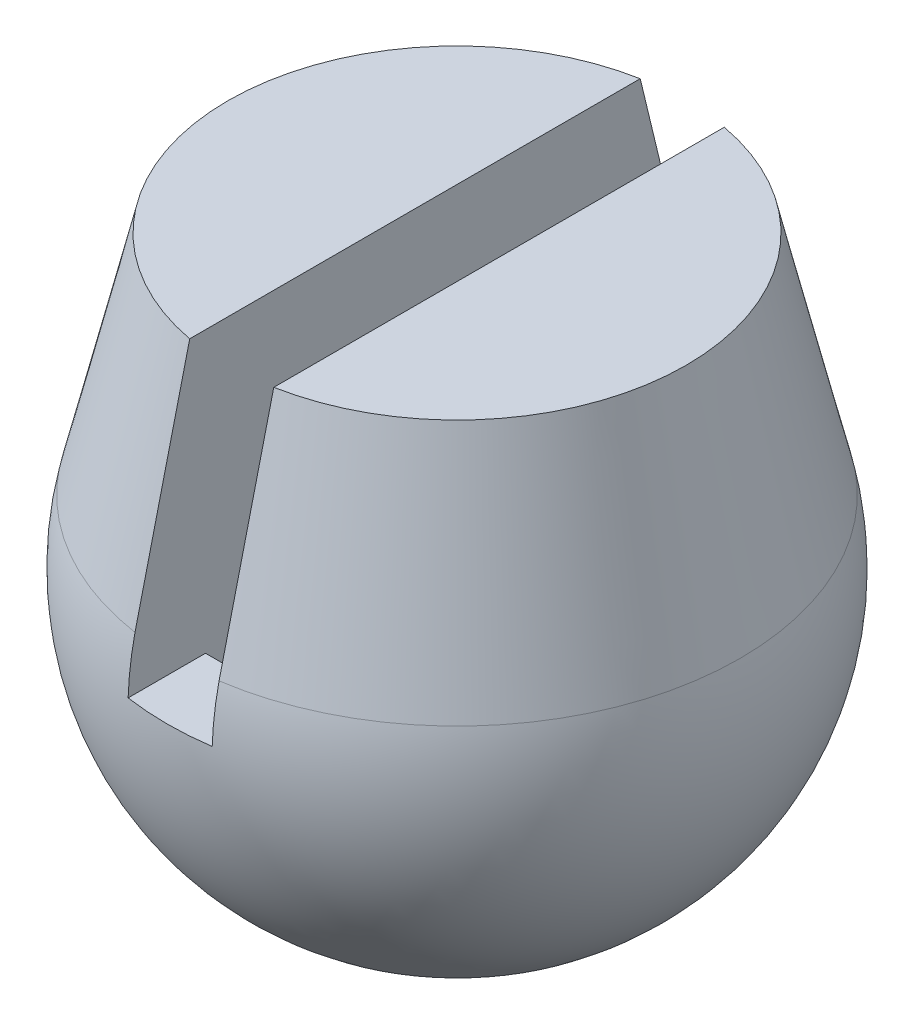
ISO-10303-21;
HEADER;
FILE_DESCRIPTION(('STEP AP214'),'2;1');
FILE_NAME('part.step','',(''),(''),'','','');
FILE_SCHEMA(('AUTOMOTIVE_DESIGN { 1 0 10303 214 1 1 1 1 }'));
ENDSEC;
DATA;
#1=APPLICATION_CONTEXT('core data for automotive mechanical design processes');
#2=APPLICATION_PROTOCOL_DEFINITION('international standard','automotive_design',2000,#1);
#3=PRODUCT_CONTEXT('',#1,'mechanical');
#4=PRODUCT('Part','Part','',(#3));
#5=PRODUCT_RELATED_PRODUCT_CATEGORY('part','',(#4));
#6=PRODUCT_DEFINITION_FORMATION('','',#4);
#7=PRODUCT_DEFINITION_CONTEXT('part definition',#1,'design');
#8=PRODUCT_DEFINITION('design','',#6,#7);
#9=PRODUCT_DEFINITION_SHAPE('','',#8);
#10=(LENGTH_UNIT() NAMED_UNIT(*) SI_UNIT(.MILLI.,.METRE.));
#11=(NAMED_UNIT(*) PLANE_ANGLE_UNIT() SI_UNIT($,.RADIAN.));
#12=(NAMED_UNIT(*) SI_UNIT($,.STERADIAN.) SOLID_ANGLE_UNIT());
#13=UNCERTAINTY_MEASURE_WITH_UNIT(LENGTH_MEASURE(1.E-05),#10,'distance_accuracy_value','');
#14=(GEOMETRIC_REPRESENTATION_CONTEXT(3) GLOBAL_UNCERTAINTY_ASSIGNED_CONTEXT((#13)) GLOBAL_UNIT_ASSIGNED_CONTEXT((#10,
#11,#12)) REPRESENTATION_CONTEXT('',''));
#15=CARTESIAN_POINT('',(0.,0.,0.));
#16=DIRECTION('',(0.,0.,1.));
#17=DIRECTION('',(1.,0.,0.));
#18=AXIS2_PLACEMENT_3D('',#15,#16,#17);
#19=CARTESIAN_POINT('',(3.,-214.296381354827,0.));
#20=DIRECTION('',(0.,-1.,0.));
#21=DIRECTION('',(0.,0.,-1.));
#22=AXIS2_PLACEMENT_3D('',#19,#20,#21);
#23=CONICAL_SURFACE('',#22,16.3539586278478,0.233560326488477);
#24=CARTESIAN_POINT('',(6.,-170.760987781292,-5.19245738028101));
#25=CARTESIAN_POINT('',(6.,-171.152339556578,-5.29997422498127));
#26=CARTESIAN_POINT('',(6.,-171.543899177338,-5.40673094624718));
#27=CARTESIAN_POINT('',(6.,-172.327371655177,-5.61893562567191));
#28=CARTESIAN_POINT('',(6.,-172.7192845111,-5.72438358809773));
#29=CARTESIAN_POINT('',(6.,-173.895452516834,-6.03907977744265));
#30=CARTESIAN_POINT('',(6.,-174.680147653396,-6.24668319219597));
#31=CARTESIAN_POINT('',(6.,-176.25036104458,-6.65863558368012));
#32=CARTESIAN_POINT('',(6.,-177.035879270145,-6.86298467142659));
#33=CARTESIAN_POINT('',(6.,-178.607561825459,-7.26919395756321));
#34=CARTESIAN_POINT('',(6.,-179.393726157788,-7.47105414595941));
#35=CARTESIAN_POINT('',(6.,-180.966514468548,-7.87281296373439));
#36=CARTESIAN_POINT('',(6.,-181.753138422609,-8.07271168859392));
#37=CARTESIAN_POINT('',(6.,-183.326782555779,-8.47094399700544));
#38=CARTESIAN_POINT('',(6.,-184.113802735074,-8.66927757981822));
#39=CARTESIAN_POINT('',(6.,-186.475342069608,-9.26238496605862));
#40=CARTESIAN_POINT('',(6.,-188.050336870837,-9.65526460523662));
#41=CARTESIAN_POINT('',(6.,-191.201194203563,-10.4375583766507));
#42=CARTESIAN_POINT('',(6.,-192.777056739577,-10.8269724906596));
#43=CARTESIAN_POINT('',(6.,-195.929400919066,-11.6032882258658));
#44=CARTESIAN_POINT('',(6.,-197.505882562779,-11.9901898460963));
#45=CARTESIAN_POINT('',(6.,-200.659422500995,-12.7621491495812));
#46=CARTESIAN_POINT('',(6.,-202.236480829917,-13.1472066921519));
#47=CARTESIAN_POINT('',(6.,-205.390948917384,-13.9158809225771));
#48=CARTESIAN_POINT('',(6.,-206.968358676022,-14.2994976100501));
#49=CARTESIAN_POINT('',(6.,-211.700980625389,-15.4486694046429));
#50=CARTESIAN_POINT('',(6.,-214.856599454792,-16.2125496559024));
#51=CARTESIAN_POINT('',(6.,-220.345678360972,-17.5386375159856));
#52=CARTESIAN_POINT('',(6.,-222.678980722647,-18.1014986045923));
#53=CARTESIAN_POINT('',(6.,-227.345876258061,-19.2260144525533));
#54=CARTESIAN_POINT('',(6.,-229.679469431814,-19.7876692118447));
#55=CARTESIAN_POINT('',(6.,-236.680587596679,-21.4712597645256));
#56=CARTESIAN_POINT('',(6.,-241.348443338517,-22.5918199281226));
#57=CARTESIAN_POINT('',(6.,-250.683987051346,-24.8304613976882));
#58=CARTESIAN_POINT('',(6.,-255.35167493703,-25.9485430595647));
#59=CARTESIAN_POINT('',(6.,-262.353483594681,-27.6244866289855));
#60=CARTESIAN_POINT('',(6.,-264.687463440813,-28.1829373980252));
#61=CARTESIAN_POINT('',(6.,-269.355502685283,-29.2995061349429));
#62=CARTESIAN_POINT('',(6.,-271.689562083618,-29.8576241028282));
#63=CARTESIAN_POINT('',(6.,-274.023654109719,-30.415605567692));
#64=B_SPLINE_CURVE_WITH_KNOTS('',3,(#24,#25,#26,#27,#28,#29,#30,#31,#32,#33,#34,#35,#36,#37,#38,
#39,#40,#41,#42,#43,#44,#45,#46,#47,#48,#49,#50,#51,#52,#53,#54,#55,#56,#57,#58,#59,#60,#61,#62,
#63),.UNSPECIFIED.,.F.,.F.,(4,2,2,2,2,2,2,2,2,2,2,2,2,2,2,2,2,2,2,4),(0.,1.21755467999411,
2.43510538930607,4.87017399931247,7.3051593625382,9.74015450005243,12.1750305121332,
14.609907674147,19.479671751555,24.3494614266647,29.2192529752596,34.0894103010007,
38.9595689160091,48.6998430181234,55.900538064785,63.1012334879054,77.5026486924067,
91.9018410898275,99.1014217965334,106.301002347248),.UNSPECIFIED.);
#65=CARTESIAN_POINT('',(6.,-214.296381354827,-16.0764412355894));
#66=VERTEX_POINT('',#65);
#67=CARTESIAN_POINT('',(6.,-230.488260536183,-19.9820927836749));
#68=VERTEX_POINT('',#67);
#69=EDGE_CURVE('E139',#66,#68,#64,.T.);
#70=ORIENTED_EDGE('',*,*,#69,.F.);
#71=CARTESIAN_POINT('',(3.,-214.296381354827,0.));
#72=DIRECTION('',(0.,1.,0.));
#73=DIRECTION('',(0.,0.,1.));
#74=AXIS2_PLACEMENT_3D('',#71,#72,#73);
#75=CIRCLE('',#74,16.3539586278478);
#76=CARTESIAN_POINT('',(6.,-214.296381354827,16.0764412355894));
#77=VERTEX_POINT('',#76);
#78=EDGE_CURVE('E123',#77,#66,#75,.T.);
#79=ORIENTED_EDGE('',*,*,#78,.F.);
#80=CARTESIAN_POINT('',(6.,-274.023654109719,30.415605567692));
#81=CARTESIAN_POINT('',(6.,-270.000477348666,29.4538125229353));
#82=CARTESIAN_POINT('',(6.,-265.977388390198,28.491651795725));
#83=CARTESIAN_POINT('',(6.,-257.931498134603,26.5662005217427));
#84=CARTESIAN_POINT('',(6.,-253.908696836375,25.6029099795729));
#85=CARTESIAN_POINT('',(6.,-245.863521936446,23.6748113527444));
#86=CARTESIAN_POINT('',(6.,-241.841148329211,22.7100032911827));
#87=CARTESIAN_POINT('',(6.,-235.807985311275,21.2611023165772));
#88=CARTESIAN_POINT('',(6.,-233.79699333259,20.7778529126038));
#89=CARTESIAN_POINT('',(6.,-229.775176294388,19.8106574887187));
#90=CARTESIAN_POINT('',(6.,-227.764351234918,19.3267114686137));
#91=CARTESIAN_POINT('',(6.,-223.458394072702,18.2894134031004));
#92=CARTESIAN_POINT('',(6.,-221.163293595189,17.7359300529398));
#93=CARTESIAN_POINT('',(6.,-216.573453368332,16.6274792065746));
#94=CARTESIAN_POINT('',(6.,-214.27871361863,16.0725117118498));
#95=CARTESIAN_POINT('',(6.,-209.689747268341,14.9605700929428));
#96=CARTESIAN_POINT('',(6.,-207.395520662324,14.4035959911745));
#97=CARTESIAN_POINT('',(6.,-202.807742764263,13.2868340441725));
#98=CARTESIAN_POINT('',(6.,-200.514191474728,12.727046188622));
#99=CARTESIAN_POINT('',(6.,-197.074583786526,11.8842349196711));
#100=CARTESIAN_POINT('',(6.,-195.928145373782,11.6027707195232));
#101=CARTESIAN_POINT('',(6.,-193.635588961686,11.0385427155266));
#102=CARTESIAN_POINT('',(6.,-192.489470962151,10.7557789124224));
#103=CARTESIAN_POINT('',(6.,-190.197651752511,10.1886192097413));
#104=CARTESIAN_POINT('',(6.,-189.051950538059,9.90422332773676));
#105=CARTESIAN_POINT('',(6.,-186.761069556327,9.33332685126513));
#106=CARTESIAN_POINT('',(6.,-185.615889790181,9.0468262522429));
#107=CARTESIAN_POINT('',(6.,-183.326175705723,8.47103377095674));
#108=CARTESIAN_POINT('',(6.,-182.181641419537,8.18174176085494));
#109=CARTESIAN_POINT('',(6.,-179.893536957816,7.59938945028861));
#110=CARTESIAN_POINT('',(6.,-178.749966776562,7.30632917234705));
#111=CARTESIAN_POINT('',(6.,-177.03563136397,6.8627051903555));
#112=CARTESIAN_POINT('',(6.,-176.464345110815,6.7141553428079));
#113=CARTESIAN_POINT('',(6.,-175.32220397032,6.41541018173933));
#114=CARTESIAN_POINT('',(6.,-174.751349082108,6.26521487155134));
#115=CARTESIAN_POINT('',(6.,-173.610160366917,5.96280809065522));
#116=CARTESIAN_POINT('',(6.,-173.039826550615,5.81059657958148));
#117=CARTESIAN_POINT('',(6.,-171.899848608291,5.50359836447139));
#118=CARTESIAN_POINT('',(6.,-171.330204487113,5.34881164245966));
#119=CARTESIAN_POINT('',(6.,-170.760987781292,5.192457380281));
#120=B_SPLINE_CURVE_WITH_KNOTS('',3,(#80,#81,#82,#83,#84,#85,#86,#87,#88,#89,#90,#91,#92,#93,
#94,#95,#96,#97,#98,#99,#100,#101,#102,#103,#104,#105,#106,#107,#108,#109,#110,#111,#112,#113,
#114,#115,#116,#117,#118,#119),.UNSPECIFIED.,.F.,.F.,(4,2,2,2,2,2,2,2,2,2,2,2,2,2,2,2,2,2,2,4),
(0.,12.4096324227305,24.8192144700223,37.2286094341486,43.433330809057,49.6380539055051,
56.7207416117209,63.80342225863,70.8860240361715,77.9686518016878,81.5101040663875,
85.05155430239,88.5929664791209,92.1343863226141,95.6759691291514,99.2175307774447,
100.988380430485,102.759226497227,104.530108071163,106.301002011313),.UNSPECIFIED.);
#121=CARTESIAN_POINT('',(6.,-230.488260536183,19.9820927836749));
#122=VERTEX_POINT('',#121);
#123=EDGE_CURVE('E130',#122,#77,#120,.T.);
#124=ORIENTED_EDGE('',*,*,#123,.F.);
#125=CARTESIAN_POINT('',(3.,-230.488260536183,0.));
#126=DIRECTION('',(0.,1.,0.));
#127=DIRECTION('',(0.,0.,1.));
#128=AXIS2_PLACEMENT_3D('',#125,#126,#127);
#129=CIRCLE('',#128,20.2060394935621);
#130=EDGE_CURVE('E11',#122,#68,#129,.T.);
#131=ORIENTED_EDGE('',*,*,#130,.T.);
#132=EDGE_LOOP('',(#70,#79,#124,#131));
#133=FACE_BOUND('',#132,.T.);
#134=ADVANCED_FACE('F43',(#133),#23,.T.);
#135=CARTESIAN_POINT('',(3.,-214.296381354827,0.));
#136=DIRECTION('',(0.,1.,0.));
#137=DIRECTION('',(0.,0.,1.));
#138=AXIS2_PLACEMENT_3D('',#135,#136,#137);
#139=PLANE('',#138);
#140=DIRECTION('',(0.,0.,1.));
#141=VECTOR('',#140,1.);
#142=CARTESIAN_POINT('',(6.,-214.296381354827,0.));
#143=LINE('',#142,#141);
#144=EDGE_CURVE('E119',#66,#77,#143,.T.);
#145=ORIENTED_EDGE('',*,*,#144,.T.);
#146=ORIENTED_EDGE('',*,*,#78,.T.);
#147=EDGE_LOOP('',(#145,#146));
#148=FACE_BOUND('',#147,.T.);
#149=ADVANCED_FACE('F121',(#148),#139,.T.);
#150=CARTESIAN_POINT('',(3.,-235.,0.));
#151=DIRECTION('',(0.,1.,0.));
#152=DIRECTION('',(0.,0.,-1.));
#153=AXIS2_PLACEMENT_3D('',#150,#151,#152);
#154=SPHERICAL_SURFACE('',#153,20.703618645173);
#155=ORIENTED_EDGE('',*,*,#130,.F.);
#156=CARTESIAN_POINT('',(6.,-235.,0.));
#157=DIRECTION('',(1.,0.,0.));
#158=DIRECTION('',(0.,0.,-1.));
#159=AXIS2_PLACEMENT_3D('',#156,#157,#158);
#160=CIRCLE('',#159,20.4851122770844);
#161=CARTESIAN_POINT('',(6.,-234.296381354827,20.4730248328604));
#162=VERTEX_POINT('',#161);
#163=EDGE_CURVE('E134',#122,#162,#160,.T.);
#164=ORIENTED_EDGE('',*,*,#163,.T.);
#165=CARTESIAN_POINT('',(3.,-234.296381354827,0.));
#166=DIRECTION('',(0.,-1.,0.));
#167=DIRECTION('',(0.,0.,-1.));
#168=AXIS2_PLACEMENT_3D('',#165,#166,#167);
#169=CIRCLE('',#168,20.6916588461853);
#170=CARTESIAN_POINT('',(0.,-234.296381354827,20.4730248328604));
#171=VERTEX_POINT('',#170);
#172=EDGE_CURVE('E203',#162,#171,#169,.T.);
#173=ORIENTED_EDGE('',*,*,#172,.T.);
#174=CARTESIAN_POINT('',(0.,-235.,0.));
#175=DIRECTION('',(-1.,0.,0.));
#176=DIRECTION('',(0.,0.,1.));
#177=AXIS2_PLACEMENT_3D('',#174,#175,#176);
#178=CIRCLE('',#177,20.4851122770844);
#179=CARTESIAN_POINT('',(0.,-230.488260536183,19.9820927836749));
#180=VERTEX_POINT('',#179);
#181=EDGE_CURVE('E137',#171,#180,#178,.T.);
#182=ORIENTED_EDGE('',*,*,#181,.T.);
#183=CARTESIAN_POINT('',(0.,-230.488260536183,-19.9820927836749));
#184=VERTEX_POINT('',#183);
#185=EDGE_CURVE('E51',#184,#180,#129,.T.);
#186=ORIENTED_EDGE('',*,*,#185,.F.);
#187=CARTESIAN_POINT('',(0.,-234.296381354827,-20.4730248328604));
#188=VERTEX_POINT('',#187);
#189=EDGE_CURVE('E193',#184,#188,#178,.T.);
#190=ORIENTED_EDGE('',*,*,#189,.T.);
#191=CARTESIAN_POINT('',(6.,-234.296381354827,-20.4730248328604));
#192=VERTEX_POINT('',#191);
#193=EDGE_CURVE('E204',#188,#192,#169,.T.);
#194=ORIENTED_EDGE('',*,*,#193,.T.);
#195=EDGE_CURVE('E164',#192,#68,#160,.T.);
#196=ORIENTED_EDGE('',*,*,#195,.T.);
#197=EDGE_LOOP('',(#155,#164,#173,#182,#186,#190,#194,#196));
#198=FACE_BOUND('',#197,.T.);
#199=ADVANCED_FACE('F45',(#198),#154,.T.);
#200=CARTESIAN_POINT('',(0.,-170.760987781292,5.192457380281));
#201=CARTESIAN_POINT('',(0.,-171.152339556578,5.29997422498126));
#202=CARTESIAN_POINT('',(0.,-171.543899177338,5.40673094624717));
#203=CARTESIAN_POINT('',(0.,-172.327371655177,5.6189356256719));
#204=CARTESIAN_POINT('',(0.,-172.7192845111,5.72438358809771));
#205=CARTESIAN_POINT('',(0.,-173.895452516834,6.03907977744264));
#206=CARTESIAN_POINT('',(0.,-174.680147653396,6.24668319219595));
#207=CARTESIAN_POINT('',(0.,-176.25036104458,6.6586355836801));
#208=CARTESIAN_POINT('',(0.,-177.035879270145,6.86298467142657));
#209=CARTESIAN_POINT('',(0.,-178.607561825459,7.2691939575632));
#210=CARTESIAN_POINT('',(0.,-179.393726157788,7.47105414595939));
#211=CARTESIAN_POINT('',(0.,-180.966514468548,7.87281296373437));
#212=CARTESIAN_POINT('',(0.,-181.753138422609,8.0727116885939));
#213=CARTESIAN_POINT('',(0.,-183.326782555779,8.47094399700542));
#214=CARTESIAN_POINT('',(0.,-184.113802735074,8.6692775798182));
#215=CARTESIAN_POINT('',(0.,-186.475342069608,9.26238496605859));
#216=CARTESIAN_POINT('',(0.,-188.050336870837,9.6552646052366));
#217=CARTESIAN_POINT('',(0.,-191.201194203563,10.4375583766507));
#218=CARTESIAN_POINT('',(0.,-192.777056739577,10.8269724906596));
#219=CARTESIAN_POINT('',(0.,-195.929400919066,11.6032882258658));
#220=CARTESIAN_POINT('',(0.,-197.505882562778,11.9901898460963));
#221=CARTESIAN_POINT('',(0.,-200.659422500995,12.7621491495812));
#222=CARTESIAN_POINT('',(0.,-202.236480829917,13.1472066921519));
#223=CARTESIAN_POINT('',(0.,-205.390948917384,13.9158809225771));
#224=CARTESIAN_POINT('',(0.,-206.968358676022,14.2994976100501));
#225=CARTESIAN_POINT('',(0.,-211.700980625389,15.4486694046428));
#226=CARTESIAN_POINT('',(0.,-214.856599454792,16.2125496559024));
#227=CARTESIAN_POINT('',(0.,-220.345678360972,17.5386375159856));
#228=CARTESIAN_POINT('',(0.,-222.678980722647,18.1014986045923));
#229=CARTESIAN_POINT('',(0.,-227.345876258061,19.2260144525533));
#230=CARTESIAN_POINT('',(0.,-229.679469431814,19.7876692118447));
#231=CARTESIAN_POINT('',(0.,-236.680587596679,21.4712597645256));
#232=CARTESIAN_POINT('',(0.,-241.348443338517,22.5918199281226));
#233=CARTESIAN_POINT('',(0.,-250.683987051346,24.8304613976882));
#234=CARTESIAN_POINT('',(0.,-255.35167493703,25.9485430595647));
#235=CARTESIAN_POINT('',(0.,-262.353483594681,27.6244866289855));
#236=CARTESIAN_POINT('',(0.,-264.687463440813,28.1829373980252));
#237=CARTESIAN_POINT('',(0.,-269.355502685283,29.299506134943));
#238=CARTESIAN_POINT('',(0.,-271.689562083618,29.8576241028282));
#239=CARTESIAN_POINT('',(0.,-274.023654109719,30.415605567692));
#240=B_SPLINE_CURVE_WITH_KNOTS('',3,(#200,#201,#202,#203,#204,#205,#206,#207,#208,#209,#210,
#211,#212,#213,#214,#215,#216,#217,#218,#219,#220,#221,#222,#223,#224,#225,#226,#227,#228,#229,
#230,#231,#232,#233,#234,#235,#236,#237,#238,#239),.UNSPECIFIED.,.F.,.F.,(4,2,2,2,2,2,2,2,2,2,2,
2,2,2,2,2,2,2,2,4),(0.,1.21755467999411,2.43510538930607,4.87017399931244,7.3051593625382,
9.7401545000524,12.1750305121331,14.6099076741469,19.4796717515549,24.3494614266647,
29.2192529752595,34.0894103010007,38.9595689160091,48.6998430181233,55.900538064785,
63.1012334879054,77.5026486924067,91.9018410898275,99.1014217965334,106.301002347248),.UNSPECIFIED.);
#241=CARTESIAN_POINT('',(0.,-214.296381354827,16.0764412355894));
#242=VERTEX_POINT('',#241);
#243=EDGE_CURVE('E187',#242,#180,#240,.T.);
#244=ORIENTED_EDGE('',*,*,#243,.F.);
#245=CARTESIAN_POINT('',(0.,-214.296381354827,-16.0764412355894));
#246=VERTEX_POINT('',#245);
#247=EDGE_CURVE('E140',#246,#242,#75,.T.);
#248=ORIENTED_EDGE('',*,*,#247,.F.);
#249=CARTESIAN_POINT('',(0.,-274.023654109719,-30.4156055676919));
#250=CARTESIAN_POINT('',(0.,-270.000477348666,-29.4538125229353));
#251=CARTESIAN_POINT('',(0.,-265.977388390198,-28.491651795725));
#252=CARTESIAN_POINT('',(0.,-257.931498134603,-26.5662005217427));
#253=CARTESIAN_POINT('',(0.,-253.908696836375,-25.6029099795728));
#254=CARTESIAN_POINT('',(0.,-245.863521936446,-23.6748113527443));
#255=CARTESIAN_POINT('',(0.,-241.841148329211,-22.7100032911827));
#256=CARTESIAN_POINT('',(0.,-235.807985311275,-21.2611023165772));
#257=CARTESIAN_POINT('',(0.,-233.79699333259,-20.7778529126038));
#258=CARTESIAN_POINT('',(0.,-229.775176294388,-19.8106574887187));
#259=CARTESIAN_POINT('',(0.,-227.764351234918,-19.3267114686137));
#260=CARTESIAN_POINT('',(0.,-223.458394072701,-18.2894134031003));
#261=CARTESIAN_POINT('',(0.,-221.163293595189,-17.7359300529398));
#262=CARTESIAN_POINT('',(0.,-216.573453368332,-16.6274792065746));
#263=CARTESIAN_POINT('',(0.,-214.27871361863,-16.0725117118497));
#264=CARTESIAN_POINT('',(0.,-209.689747268341,-14.9605700929428));
#265=CARTESIAN_POINT('',(0.,-207.395520662324,-14.4035959911744));
#266=CARTESIAN_POINT('',(0.,-202.807742764263,-13.2868340441725));
#267=CARTESIAN_POINT('',(0.,-200.514191474728,-12.727046188622));
#268=CARTESIAN_POINT('',(0.,-197.074583786526,-11.8842349196711));
#269=CARTESIAN_POINT('',(0.,-195.928145373782,-11.6027707195232));
#270=CARTESIAN_POINT('',(0.,-193.635588961686,-11.0385427155266));
#271=CARTESIAN_POINT('',(0.,-192.489470962151,-10.7557789124224));
#272=CARTESIAN_POINT('',(0.,-190.197651752511,-10.1886192097413));
#273=CARTESIAN_POINT('',(0.,-189.051950538059,-9.90422332773677));
#274=CARTESIAN_POINT('',(0.,-186.761069556327,-9.33332685126515));
#275=CARTESIAN_POINT('',(0.,-185.615889790181,-9.04682625224292));
#276=CARTESIAN_POINT('',(0.,-183.326175705723,-8.47103377095676));
#277=CARTESIAN_POINT('',(0.,-182.181641419537,-8.18174176085495));
#278=CARTESIAN_POINT('',(0.,-179.893536957816,-7.59938945028862));
#279=CARTESIAN_POINT('',(0.,-178.749966776562,-7.30632917234706));
#280=CARTESIAN_POINT('',(0.,-177.03563136397,-6.86270519035551));
#281=CARTESIAN_POINT('',(0.,-176.464345110815,-6.71415534280791));
#282=CARTESIAN_POINT('',(0.,-175.32220397032,-6.41541018173934));
#283=CARTESIAN_POINT('',(0.,-174.751349082108,-6.26521487155135));
#284=CARTESIAN_POINT('',(0.,-173.610160366917,-5.96280809065523));
#285=CARTESIAN_POINT('',(0.,-173.039826550615,-5.81059657958149));
#286=CARTESIAN_POINT('',(0.,-171.899848608291,-5.5035983644714));
#287=CARTESIAN_POINT('',(0.,-171.330204487113,-5.34881164245968));
#288=CARTESIAN_POINT('',(0.,-170.760987781292,-5.19245738028101));
#289=B_SPLINE_CURVE_WITH_KNOTS('',3,(#249,#250,#251,#252,#253,#254,#255,#256,#257,#258,#259,
#260,#261,#262,#263,#264,#265,#266,#267,#268,#269,#270,#271,#272,#273,#274,#275,#276,#277,#278,
#279,#280,#281,#282,#283,#284,#285,#286,#287,#288),.UNSPECIFIED.,.F.,.F.,(4,2,2,2,2,2,2,2,2,2,2,
2,2,2,2,2,2,2,2,4),(0.,12.4096324227305,24.8192144700223,37.2286094341485,43.433330809057,
49.6380539055051,56.720741611721,63.8034222586301,70.8860240361715,77.9686518016878,
81.5101040663875,85.05155430239,88.5929664791209,92.134386322614,95.6759691291514,
99.2175307774447,100.988380430485,102.759226497227,104.530108071163,106.301002011313),.UNSPECIFIED.);
#290=EDGE_CURVE('E196',#184,#246,#289,.T.);
#291=ORIENTED_EDGE('',*,*,#290,.F.);
#292=ORIENTED_EDGE('',*,*,#185,.T.);
#293=EDGE_LOOP('',(#244,#248,#291,#292));
#294=FACE_BOUND('',#293,.T.);
#295=ADVANCED_FACE('F171',(#294),#23,.T.);
#296=DIRECTION('',(0.,0.,1.));
#297=VECTOR('',#296,1.);
#298=CARTESIAN_POINT('',(0.,-214.296381354827,0.));
#299=LINE('',#298,#297);
#300=EDGE_CURVE('E154',#246,#242,#299,.T.);
#301=ORIENTED_EDGE('',*,*,#300,.F.);
#302=ORIENTED_EDGE('',*,*,#247,.T.);
#303=EDGE_LOOP('',(#301,#302));
#304=FACE_BOUND('',#303,.T.);
#305=ADVANCED_FACE('F229',(#304),#139,.T.);
#306=CARTESIAN_POINT('',(6.,-0.126903553299598,-1.77664974619423));
#307=DIRECTION('',(0.,-0.0712470499879153,-0.997458699830735));
#308=DIRECTION('',(0.,0.997458699830735,-0.0712470499879153));
#309=AXIS2_PLACEMENT_3D('',#306,#307,#308);
#310=PLANE('',#309);
#311=DIRECTION('',(-1.,0.,0.));
#312=VECTOR('',#311,1.);
#313=CARTESIAN_POINT('',(6.,-234.296381354827,14.9497415253448));
#314=LINE('',#313,#312);
#315=CARTESIAN_POINT('',(6.,-234.296381354827,14.9497415253448));
#316=VERTEX_POINT('',#315);
#317=CARTESIAN_POINT('',(0.,-234.296381354827,14.9497415253448));
#318=VERTEX_POINT('',#317);
#319=EDGE_CURVE('E207',#316,#318,#314,.T.);
#320=ORIENTED_EDGE('',*,*,#319,.F.);
#321=DIRECTION('',(0.,-0.997458699830735,0.0712470499879153));
#322=VECTOR('',#321,1.);
#323=CARTESIAN_POINT('',(6.,-0.126903553299598,-1.77664974619423));
#324=LINE('',#323,#322);
#325=CARTESIAN_POINT('',(6.,-235.,15.));
#326=VERTEX_POINT('',#325);
#327=EDGE_CURVE('E152',#316,#326,#324,.T.);
#328=ORIENTED_EDGE('',*,*,#327,.T.);
#329=DIRECTION('',(-1.,0.,0.));
#330=VECTOR('',#329,1.);
#331=CARTESIAN_POINT('',(6.,-235.,15.));
#332=LINE('',#331,#330);
#333=CARTESIAN_POINT('',(0.,-235.,15.));
#334=VERTEX_POINT('',#333);
#335=EDGE_CURVE('E143',#326,#334,#332,.T.);
#336=ORIENTED_EDGE('',*,*,#335,.T.);
#337=DIRECTION('',(0.,-0.997458699830735,0.0712470499879153));
#338=VECTOR('',#337,1.);
#339=CARTESIAN_POINT('',(0.,-0.126903553299598,-1.77664974619423));
#340=LINE('',#339,#338);
#341=EDGE_CURVE('E162',#318,#334,#340,.T.);
#342=ORIENTED_EDGE('',*,*,#341,.F.);
#343=EDGE_LOOP('',(#320,#328,#336,#342));
#344=FACE_BOUND('',#343,.T.);
#345=ADVANCED_FACE('F236',(#344),#310,.T.);
#346=CARTESIAN_POINT('',(6.,-235.,0.));
#347=DIRECTION('',(-1.,0.,0.));
#348=DIRECTION('',(0.,0.,1.));
#349=AXIS2_PLACEMENT_3D('',#346,#347,#348);
#350=CYLINDRICAL_SURFACE('',#349,15.);
#351=ORIENTED_EDGE('',*,*,#335,.F.);
#352=CARTESIAN_POINT('',(6.,-235.,0.));
#353=DIRECTION('',(1.,0.,0.));
#354=DIRECTION('',(0.,0.,-1.));
#355=AXIS2_PLACEMENT_3D('',#352,#353,#354);
#356=CIRCLE('',#355,15.);
#357=CARTESIAN_POINT('',(6.,-235.,-15.));
#358=VERTEX_POINT('',#357);
#359=EDGE_CURVE('E150',#326,#358,#356,.T.);
#360=ORIENTED_EDGE('',*,*,#359,.T.);
#361=DIRECTION('',(-1.,0.,0.));
#362=VECTOR('',#361,1.);
#363=CARTESIAN_POINT('',(6.,-235.,-15.));
#364=LINE('',#363,#362);
#365=CARTESIAN_POINT('',(0.,-235.,-15.));
#366=VERTEX_POINT('',#365);
#367=EDGE_CURVE('E126',#358,#366,#364,.T.);
#368=ORIENTED_EDGE('',*,*,#367,.T.);
#369=CARTESIAN_POINT('',(0.,-235.,0.));
#370=DIRECTION('',(1.,0.,0.));
#371=DIRECTION('',(0.,0.,-1.));
#372=AXIS2_PLACEMENT_3D('',#369,#370,#371);
#373=CIRCLE('',#372,15.);
#374=EDGE_CURVE('E159',#334,#366,#373,.T.);
#375=ORIENTED_EDGE('',*,*,#374,.F.);
#376=EDGE_LOOP('',(#351,#360,#368,#375));
#377=FACE_BOUND('',#376,.T.);
#378=ADVANCED_FACE('F241',(#377),#350,.F.);
#379=CARTESIAN_POINT('',(6.,-0.126903553299511,1.77664974619313));
#380=DIRECTION('',(0.,-0.0712470499879107,0.997458699830735));
#381=DIRECTION('',(0.,-0.997458699830735,-0.0712470499879107));
#382=AXIS2_PLACEMENT_3D('',#379,#380,#381);
#383=PLANE('',#382);
#384=DIRECTION('',(1.,0.,0.));
#385=VECTOR('',#384,1.);
#386=CARTESIAN_POINT('',(6.,-234.296381354827,-14.9497415253448));
#387=LINE('',#386,#385);
#388=CARTESIAN_POINT('',(0.,-234.296381354827,-14.9497415253448));
#389=VERTEX_POINT('',#388);
#390=CARTESIAN_POINT('',(6.,-234.296381354827,-14.9497415253448));
#391=VERTEX_POINT('',#390);
#392=EDGE_CURVE('E209',#389,#391,#387,.T.);
#393=ORIENTED_EDGE('',*,*,#392,.F.);
#394=DIRECTION('',(0.,0.997458699830735,0.0712470499879107));
#395=VECTOR('',#394,1.);
#396=CARTESIAN_POINT('',(0.,-0.126903553299511,1.77664974619313));
#397=LINE('',#396,#395);
#398=EDGE_CURVE('E156',#366,#389,#397,.T.);
#399=ORIENTED_EDGE('',*,*,#398,.F.);
#400=ORIENTED_EDGE('',*,*,#367,.F.);
#401=DIRECTION('',(0.,0.997458699830735,0.0712470499879107));
#402=VECTOR('',#401,1.);
#403=CARTESIAN_POINT('',(6.,-0.126903553299511,1.77664974619313));
#404=LINE('',#403,#402);
#405=EDGE_CURVE('E127',#358,#391,#404,.T.);
#406=ORIENTED_EDGE('',*,*,#405,.T.);
#407=EDGE_LOOP('',(#393,#399,#400,#406));
#408=FACE_BOUND('',#407,.T.);
#409=ADVANCED_FACE('F244',(#408),#383,.T.);
#410=CARTESIAN_POINT('',(6.,0.,0.));
#411=DIRECTION('',(1.,0.,0.));
#412=DIRECTION('',(0.,0.,-1.));
#413=AXIS2_PLACEMENT_3D('',#410,#411,#412);
#414=PLANE('',#413);
#415=ORIENTED_EDGE('',*,*,#327,.F.);
#416=DIRECTION('',(0.,0.,-1.));
#417=VECTOR('',#416,1.);
#418=CARTESIAN_POINT('',(6.,-234.296381354827,23.84));
#419=LINE('',#418,#417);
#420=EDGE_CURVE('E58',#162,#316,#419,.T.);
#421=ORIENTED_EDGE('',*,*,#420,.F.);
#422=ORIENTED_EDGE('',*,*,#163,.F.);
#423=ORIENTED_EDGE('',*,*,#123,.T.);
#424=ORIENTED_EDGE('',*,*,#144,.F.);
#425=ORIENTED_EDGE('',*,*,#69,.T.);
#426=ORIENTED_EDGE('',*,*,#195,.F.);
#427=EDGE_CURVE('E214',#391,#192,#419,.T.);
#428=ORIENTED_EDGE('',*,*,#427,.F.);
#429=ORIENTED_EDGE('',*,*,#405,.F.);
#430=ORIENTED_EDGE('',*,*,#359,.F.);
#431=EDGE_LOOP('',(#415,#421,#422,#423,#424,#425,#426,#428,#429,#430));
#432=FACE_BOUND('',#431,.T.);
#433=ADVANCED_FACE('F132',(#432),#414,.F.);
#434=CARTESIAN_POINT('',(0.,0.,0.));
#435=DIRECTION('',(1.,0.,0.));
#436=DIRECTION('',(0.,0.,-1.));
#437=AXIS2_PLACEMENT_3D('',#434,#435,#436);
#438=PLANE('',#437);
#439=ORIENTED_EDGE('',*,*,#398,.T.);
#440=DIRECTION('',(0.,0.,1.));
#441=VECTOR('',#440,1.);
#442=CARTESIAN_POINT('',(0.,-234.296381354827,23.84));
#443=LINE('',#442,#441);
#444=EDGE_CURVE('E66',#188,#389,#443,.T.);
#445=ORIENTED_EDGE('',*,*,#444,.F.);
#446=ORIENTED_EDGE('',*,*,#189,.F.);
#447=ORIENTED_EDGE('',*,*,#290,.T.);
#448=ORIENTED_EDGE('',*,*,#300,.T.);
#449=ORIENTED_EDGE('',*,*,#243,.T.);
#450=ORIENTED_EDGE('',*,*,#181,.F.);
#451=EDGE_CURVE('E211',#318,#171,#443,.T.);
#452=ORIENTED_EDGE('',*,*,#451,.F.);
#453=ORIENTED_EDGE('',*,*,#341,.T.);
#454=ORIENTED_EDGE('',*,*,#374,.T.);
#455=EDGE_LOOP('',(#439,#445,#446,#447,#448,#449,#450,#452,#453,#454));
#456=FACE_BOUND('',#455,.T.);
#457=ADVANCED_FACE('F179',(#456),#438,.T.);
#458=CARTESIAN_POINT('',(0.,-234.296381354827,0.));
#459=DIRECTION('',(0.,-1.,0.));
#460=DIRECTION('',(0.,0.,-1.));
#461=AXIS2_PLACEMENT_3D('',#458,#459,#460);
#462=PLANE('',#461);
#463=ORIENTED_EDGE('',*,*,#444,.T.);
#464=ORIENTED_EDGE('',*,*,#392,.T.);
#465=ORIENTED_EDGE('',*,*,#427,.T.);
#466=ORIENTED_EDGE('',*,*,#193,.F.);
#467=EDGE_LOOP('',(#463,#464,#465,#466));
#468=FACE_BOUND('',#467,.T.);
#469=ADVANCED_FACE('F217',(#468),#462,.F.);
#470=ORIENTED_EDGE('',*,*,#420,.T.);
#471=ORIENTED_EDGE('',*,*,#319,.T.);
#472=ORIENTED_EDGE('',*,*,#451,.T.);
#473=ORIENTED_EDGE('',*,*,#172,.F.);
#474=EDGE_LOOP('',(#470,#471,#472,#473));
#475=FACE_BOUND('',#474,.T.);
#476=ADVANCED_FACE('F232',(#475),#462,.F.);
#477=CLOSED_SHELL('',(#134,#149,#199,#295,#305,#345,#378,#409,#433,#457,#469,#476));
#478=MANIFOLD_SOLID_BREP('B2',#477);
#479=ADVANCED_BREP_SHAPE_REPRESENTATION('',(#18,#478),#14);
#480=SHAPE_DEFINITION_REPRESENTATION(#9,#479);
ENDSEC;
END-ISO-10303-21;
